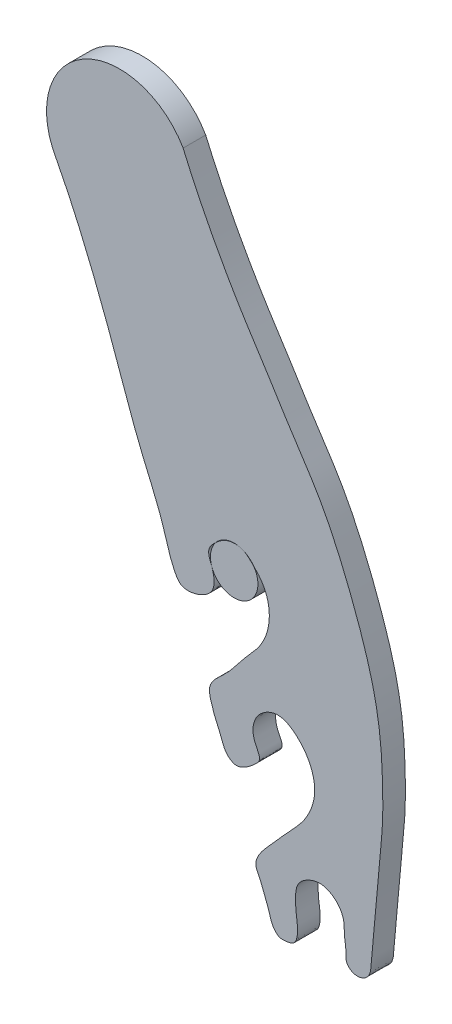
ISO-10303-21;
HEADER;
FILE_DESCRIPTION(('STEP AP214'),'2;1');
FILE_NAME('part.step','',(''),(''),'','','');
FILE_SCHEMA(('AUTOMOTIVE_DESIGN { 1 0 10303 214 1 1 1 1 }'));
ENDSEC;
DATA;
#1=APPLICATION_CONTEXT('core data for automotive mechanical design processes');
#2=APPLICATION_PROTOCOL_DEFINITION('international standard','automotive_design',2000,#1);
#3=PRODUCT_CONTEXT('',#1,'mechanical');
#4=PRODUCT('Part','Part','',(#3));
#5=PRODUCT_RELATED_PRODUCT_CATEGORY('part','',(#4));
#6=PRODUCT_DEFINITION_FORMATION('','',#4);
#7=PRODUCT_DEFINITION_CONTEXT('part definition',#1,'design');
#8=PRODUCT_DEFINITION('design','',#6,#7);
#9=PRODUCT_DEFINITION_SHAPE('','',#8);
#10=(LENGTH_UNIT() NAMED_UNIT(*) SI_UNIT(.MILLI.,.METRE.));
#11=(NAMED_UNIT(*) PLANE_ANGLE_UNIT() SI_UNIT($,.RADIAN.));
#12=(NAMED_UNIT(*) SI_UNIT($,.STERADIAN.) SOLID_ANGLE_UNIT());
#13=UNCERTAINTY_MEASURE_WITH_UNIT(LENGTH_MEASURE(1.E-05),#10,'distance_accuracy_value','');
#14=(GEOMETRIC_REPRESENTATION_CONTEXT(3) GLOBAL_UNCERTAINTY_ASSIGNED_CONTEXT((#13)) GLOBAL_UNIT_ASSIGNED_CONTEXT((#10,
#11,#12)) REPRESENTATION_CONTEXT('',''));
#15=CARTESIAN_POINT('',(0.,0.,0.));
#16=DIRECTION('',(0.,0.,1.));
#17=DIRECTION('',(1.,0.,0.));
#18=AXIS2_PLACEMENT_3D('',#15,#16,#17);
#19=CARTESIAN_POINT('',(-59.0867335114056,75.1585197037627,5.));
#20=CARTESIAN_POINT('',(-53.9346204091216,65.3788628462463,5.));
#21=CARTESIAN_POINT('',(-47.4390554512581,48.6837082710349,5.));
#22=CARTESIAN_POINT('',(-40.688736558049,28.9009979278177,5.));
#23=CARTESIAN_POINT('',(-35.5304183724358,18.0879657647005,5.));
#24=CARTESIAN_POINT('',(-33.8579577809246,10.7674343070757,5.));
#25=CARTESIAN_POINT('',(-31.3998362996276,6.57802106677436,5.));
#26=CARTESIAN_POINT('',(-27.5219492365526,7.01581801573386,5.));
#27=CARTESIAN_POINT('',(-23.9393229583878,9.27671727307309,5.));
#28=CARTESIAN_POINT('',(-24.0764116949098,13.535807514395,5.));
#29=CARTESIAN_POINT('',(-26.0223548032744,16.8232194647874,5.));
#30=CARTESIAN_POINT('',(-23.7500171417823,19.2982600625414,5.));
#31=CARTESIAN_POINT('',(-21.376028013917,21.2083047046469,5.));
#32=CARTESIAN_POINT('',(-17.7857469963341,21.2749184106261,5.));
#33=CARTESIAN_POINT('',(-15.8633790549527,19.3467985373797,5.));
#34=CARTESIAN_POINT('',(-14.1859396027409,17.7776622603364,5.));
#35=CARTESIAN_POINT('',(-12.3297106987941,15.0320557236874,5.));
#36=CARTESIAN_POINT('',(-11.4507685126685,10.0831162070745,5.));
#37=CARTESIAN_POINT('',(-13.3013060927024,4.55321523133934,5.));
#38=CARTESIAN_POINT('',(-17.8022226632041,0.0201694124523161,5.));
#39=CARTESIAN_POINT('',(-20.9236233601872,-4.70848851190603,5.));
#40=CARTESIAN_POINT('',(-25.6848919148439,-8.24729106828771,5.));
#41=CARTESIAN_POINT('',(-24.7171376000372,-12.3130908454352,5.));
#42=CARTESIAN_POINT('',(-23.7107567909008,-14.9774131674311,5.));
#43=CARTESIAN_POINT('',(-22.4756437758101,-17.5194111133045,5.));
#44=CARTESIAN_POINT('',(-21.7661820410865,-19.9616882709617,5.));
#45=CARTESIAN_POINT('',(-19.5677147424994,-21.6347614524844,5.));
#46=CARTESIAN_POINT('',(-17.0547050234001,-20.6234032452875,5.));
#47=CARTESIAN_POINT('',(-15.5148303275544,-19.3564667024287,5.));
#48=CARTESIAN_POINT('',(-13.6022413210824,-17.5441766860558,5.));
#49=CARTESIAN_POINT('',(-14.9603130437095,-15.2605382390708,5.));
#50=CARTESIAN_POINT('',(-15.7735877062972,-12.8169202748397,5.));
#51=CARTESIAN_POINT('',(-15.0948052191953,-9.85813829907841,5.));
#52=CARTESIAN_POINT('',(-12.9329369021278,-7.64371398063303,5.));
#53=CARTESIAN_POINT('',(-9.34166022804247,-6.43458878607931,5.));
#54=CARTESIAN_POINT('',(-5.4913749908454,-8.89757267070106,5.));
#55=CARTESIAN_POINT('',(-2.61301967575609,-12.6523587155516,5.));
#56=CARTESIAN_POINT('',(-1.56389084367576,-16.9770722154025,5.));
#57=CARTESIAN_POINT('',(-2.36809171631675,-20.9530875801138,5.));
#58=CARTESIAN_POINT('',(-4.25580525672841,-24.7009833933603,5.));
#59=CARTESIAN_POINT('',(-7.94237305607287,-28.466412654136,5.));
#60=CARTESIAN_POINT('',(-11.2363704668022,-32.2563884624217,5.));
#61=CARTESIAN_POINT('',(-13.9760508604816,-35.2296970965984,5.));
#62=CARTESIAN_POINT('',(-15.3063342429994,-38.0056889369046,5.));
#63=CARTESIAN_POINT('',(-13.922413952706,-40.2924528659359,5.));
#64=CARTESIAN_POINT('',(-13.1613990437115,-42.6176153595309,5.));
#65=CARTESIAN_POINT('',(-11.9897255447287,-45.2208306103088,5.));
#66=CARTESIAN_POINT('',(-11.508081610577,-47.7300220017059,5.));
#67=CARTESIAN_POINT('',(-9.86460186479938,-49.6721462729771,5.));
#68=CARTESIAN_POINT('',(-8.0547933575021,-49.4360233240608,5.));
#69=CARTESIAN_POINT('',(-6.19232498721251,-49.1607775023665,5.));
#70=CARTESIAN_POINT('',(-5.39620881542955,-46.3293059076238,5.));
#71=CARTESIAN_POINT('',(-5.95883219850282,-43.5509240436483,5.));
#72=CARTESIAN_POINT('',(-6.16851216774349,-40.2747659189104,5.));
#73=CARTESIAN_POINT('',(-5.99107213557137,-36.944497525088,5.));
#74=CARTESIAN_POINT('',(-3.31852216918873,-35.1012060667395,5.));
#75=CARTESIAN_POINT('',(-0.290133931830342,-34.2367562773027,5.));
#76=CARTESIAN_POINT('',(2.91584490100474,-35.7194969765132,5.));
#77=CARTESIAN_POINT('',(4.83146565858147,-38.7939492716301,5.));
#78=CARTESIAN_POINT('',(4.57059921095419,-42.077947310441,5.));
#79=CARTESIAN_POINT('',(5.22994309111668,-44.5841258956665,5.));
#80=CARTESIAN_POINT('',(4.92243771096731,-46.9269893259378,5.));
#81=CARTESIAN_POINT('',(6.59325327361756,-48.3133735595361,5.));
#82=CARTESIAN_POINT('',(8.63285925629375,-48.2844375815708,5.));
#83=CARTESIAN_POINT('',(10.3966410742948,-46.9214790088415,5.));
#84=CARTESIAN_POINT('',(10.6173195335293,-44.9495485284818,5.));
#85=CARTESIAN_POINT('',(10.8674362114861,-41.3465905762235,5.));
#86=CARTESIAN_POINT('',(11.3633249928665,-36.2232794673163,5.));
#87=CARTESIAN_POINT('',(12.0194329999847,-29.4871876869167,5.));
#88=CARTESIAN_POINT('',(12.5335656742452,-23.2802796795894,5.));
#89=CARTESIAN_POINT('',(13.2669361389922,-16.3210261485607,5.));
#90=CARTESIAN_POINT('',(13.2468383043408,-8.52578424672956,5.));
#91=CARTESIAN_POINT('',(12.7699809470057,0.115298957737392,5.));
#92=CARTESIAN_POINT('',(11.290030544535,8.71315325813478,5.));
#93=CARTESIAN_POINT('',(8.57964158769924,17.7147110875001,5.));
#94=CARTESIAN_POINT('',(4.65918935140636,28.1010516349342,5.));
#95=CARTESIAN_POINT('',(-0.377397825888756,39.1219031126708,5.));
#96=CARTESIAN_POINT('',(-6.82410773435023,48.3529544080711,5.));
#97=CARTESIAN_POINT('',(-11.9337184412852,56.8018556725787,5.));
#98=CARTESIAN_POINT('',(-20.7413347246258,70.1682609110035,5.));
#99=CARTESIAN_POINT('',(-26.9668790339203,81.8525052067424,5.));
#100=CARTESIAN_POINT('',(-30.9850079375646,91.196598097639,5.));
#101=B_SPLINE_CURVE_WITH_KNOTS('',3,(#19,#20,#21,#22,#23,#24,#25,#26,#27,#28,#29,#30,#31,#32,
#33,#34,#35,#36,#37,#38,#39,#40,#41,#42,#43,#44,#45,#46,#47,#48,#49,#50,#51,#52,#53,#54,#55,#56,
#57,#58,#59,#60,#61,#62,#63,#64,#65,#66,#67,#68,#69,#70,#71,#72,#73,#74,#75,#76,#77,#78,#79,#80,
#81,#82,#83,#84,#85,#86,#87,#88,#89,#90,#91,#92,#93,#94,#95,#96,#97,#98,#99,#100),.UNSPECIFIED.,
.F.,.F.,(4,1,1,1,1,1,1,1,1,1,1,1,1,1,1,1,1,1,1,1,1,1,1,1,1,1,1,1,1,1,1,1,1,1,1,1,1,1,1,1,1,1,1,
1,1,1,1,1,1,1,1,1,1,1,1,1,1,1,1,1,1,1,1,1,1,1,1,1,1,1,1,1,1,1,1,1,1,1,1,4),(0.,
0.0873394569445019,0.122518205965547,0.154526003355046,0.17363433754046,0.178356300677547,
0.1877523400195,0.197551247951358,0.206693528219401,0.216055212640687,0.221691693059472,
0.228804145433702,0.238707717567774,0.243941058255248,0.248249108767906,0.255571386644435,
0.26771931673974,0.283616469639116,0.296048224297848,0.313658019399417,0.326739548103663,
0.333250370237918,0.341962212801237,0.348063705877538,0.353713631020725,0.360676314080626,
0.364714938147767,0.37220145986358,0.376188830279465,0.38172475237111,0.388580265037037,
0.395502953628737,0.402401832386903,0.410616688302792,0.420878683707496,0.432954596079819,
0.445134806791692,0.451805617843627,0.462304251521838,0.475264191504644,0.490195111733352,
0.498691187242873,0.505626304596028,0.510038062198198,0.517164296365818,0.52379498348039,
0.5306412037791,0.53610900844786,0.539904406161453,0.543418663303669,0.548956490323289,
0.558110843502625,0.564731092106327,0.573167651760435,0.580565976871937,0.58663496770464,
0.595642441347538,0.604032026473668,0.611503439642707,0.61900125364726,0.623087474934673,
0.627664111858408,0.632724642143198,0.637027562650227,0.642687153488735,0.64635277806698,
0.663711927803744,0.680091231539028,0.695897733555089,0.709224188427907,0.731217372067665,
0.752778927598718,0.772428430989962,0.794821979949094,0.821372889404584,0.853601156451222,
0.883019250234345,0.903483119478519,0.925781115889162,1.),.UNSPECIFIED.);
#102=DIRECTION('',(0.,0.,-1.));
#103=VECTOR('',#102,1.);
#104=SURFACE_OF_LINEAR_EXTRUSION('',#101,#103);
#105=CARTESIAN_POINT('',(-59.0867335114056,75.1585197037627,0.));
#106=CARTESIAN_POINT('',(-53.9346204091216,65.3788628462463,0.));
#107=CARTESIAN_POINT('',(-47.4390554512581,48.6837082710349,0.));
#108=CARTESIAN_POINT('',(-40.688736558049,28.9009979278177,0.));
#109=CARTESIAN_POINT('',(-35.5304183724358,18.0879657647005,0.));
#110=CARTESIAN_POINT('',(-33.8579577809246,10.7674343070757,0.));
#111=CARTESIAN_POINT('',(-31.3998362996276,6.57802106677436,0.));
#112=CARTESIAN_POINT('',(-27.5219492365526,7.01581801573386,0.));
#113=CARTESIAN_POINT('',(-23.9393229583878,9.27671727307309,0.));
#114=CARTESIAN_POINT('',(-24.0764116949098,13.535807514395,0.));
#115=CARTESIAN_POINT('',(-26.0223548032744,16.8232194647874,0.));
#116=CARTESIAN_POINT('',(-23.7500171417823,19.2982600625414,0.));
#117=CARTESIAN_POINT('',(-21.376028013917,21.2083047046469,0.));
#118=CARTESIAN_POINT('',(-17.7857469963341,21.2749184106261,0.));
#119=CARTESIAN_POINT('',(-15.8633790549527,19.3467985373797,0.));
#120=CARTESIAN_POINT('',(-14.1859396027409,17.7776622603364,0.));
#121=CARTESIAN_POINT('',(-12.3297106987941,15.0320557236874,0.));
#122=CARTESIAN_POINT('',(-11.4507685126685,10.0831162070745,0.));
#123=CARTESIAN_POINT('',(-13.3013060927024,4.55321523133934,0.));
#124=CARTESIAN_POINT('',(-17.8022226632041,0.0201694124523161,0.));
#125=CARTESIAN_POINT('',(-20.9236233601872,-4.70848851190603,0.));
#126=CARTESIAN_POINT('',(-25.6848919148439,-8.24729106828771,0.));
#127=CARTESIAN_POINT('',(-24.7171376000372,-12.3130908454352,0.));
#128=CARTESIAN_POINT('',(-23.7107567909008,-14.9774131674311,0.));
#129=CARTESIAN_POINT('',(-22.4756437758101,-17.5194111133045,0.));
#130=CARTESIAN_POINT('',(-21.7661820410865,-19.9616882709617,0.));
#131=CARTESIAN_POINT('',(-19.5677147424994,-21.6347614524844,0.));
#132=CARTESIAN_POINT('',(-17.0547050234001,-20.6234032452875,0.));
#133=CARTESIAN_POINT('',(-15.5148303275544,-19.3564667024287,0.));
#134=CARTESIAN_POINT('',(-13.6022413210824,-17.5441766860558,0.));
#135=CARTESIAN_POINT('',(-14.9603130437095,-15.2605382390708,0.));
#136=CARTESIAN_POINT('',(-15.7735877062972,-12.8169202748397,0.));
#137=CARTESIAN_POINT('',(-15.0948052191953,-9.85813829907841,0.));
#138=CARTESIAN_POINT('',(-12.9329369021278,-7.64371398063303,0.));
#139=CARTESIAN_POINT('',(-9.34166022804247,-6.43458878607931,0.));
#140=CARTESIAN_POINT('',(-5.4913749908454,-8.89757267070106,0.));
#141=CARTESIAN_POINT('',(-2.61301967575609,-12.6523587155516,0.));
#142=CARTESIAN_POINT('',(-1.56389084367576,-16.9770722154025,0.));
#143=CARTESIAN_POINT('',(-2.36809171631675,-20.9530875801138,0.));
#144=CARTESIAN_POINT('',(-4.25580525672841,-24.7009833933603,0.));
#145=CARTESIAN_POINT('',(-7.94237305607287,-28.466412654136,0.));
#146=CARTESIAN_POINT('',(-11.2363704668022,-32.2563884624217,0.));
#147=CARTESIAN_POINT('',(-13.9760508604816,-35.2296970965984,0.));
#148=CARTESIAN_POINT('',(-15.3063342429994,-38.0056889369046,0.));
#149=CARTESIAN_POINT('',(-13.922413952706,-40.2924528659359,0.));
#150=CARTESIAN_POINT('',(-13.1613990437115,-42.6176153595309,0.));
#151=CARTESIAN_POINT('',(-11.9897255447287,-45.2208306103088,0.));
#152=CARTESIAN_POINT('',(-11.508081610577,-47.7300220017059,0.));
#153=CARTESIAN_POINT('',(-9.86460186479938,-49.6721462729771,0.));
#154=CARTESIAN_POINT('',(-8.0547933575021,-49.4360233240608,0.));
#155=CARTESIAN_POINT('',(-6.19232498721251,-49.1607775023665,0.));
#156=CARTESIAN_POINT('',(-5.39620881542955,-46.3293059076238,0.));
#157=CARTESIAN_POINT('',(-5.95883219850282,-43.5509240436483,0.));
#158=CARTESIAN_POINT('',(-6.16851216774349,-40.2747659189104,0.));
#159=CARTESIAN_POINT('',(-5.99107213557137,-36.944497525088,0.));
#160=CARTESIAN_POINT('',(-3.31852216918873,-35.1012060667395,0.));
#161=CARTESIAN_POINT('',(-0.290133931830342,-34.2367562773027,0.));
#162=CARTESIAN_POINT('',(2.91584490100474,-35.7194969765132,0.));
#163=CARTESIAN_POINT('',(4.83146565858147,-38.7939492716301,0.));
#164=CARTESIAN_POINT('',(4.57059921095419,-42.077947310441,0.));
#165=CARTESIAN_POINT('',(5.22994309111668,-44.5841258956665,0.));
#166=CARTESIAN_POINT('',(4.92243771096731,-46.9269893259378,0.));
#167=CARTESIAN_POINT('',(6.59325327361756,-48.3133735595361,0.));
#168=CARTESIAN_POINT('',(8.63285925629375,-48.2844375815708,0.));
#169=CARTESIAN_POINT('',(10.3966410742948,-46.9214790088415,0.));
#170=CARTESIAN_POINT('',(10.6173195335293,-44.9495485284818,0.));
#171=CARTESIAN_POINT('',(10.8674362114861,-41.3465905762235,0.));
#172=CARTESIAN_POINT('',(11.3633249928665,-36.2232794673163,0.));
#173=CARTESIAN_POINT('',(12.0194329999847,-29.4871876869167,0.));
#174=CARTESIAN_POINT('',(12.5335656742452,-23.2802796795894,0.));
#175=CARTESIAN_POINT('',(13.2669361389922,-16.3210261485607,0.));
#176=CARTESIAN_POINT('',(13.2468383043408,-8.52578424672956,0.));
#177=CARTESIAN_POINT('',(12.7699809470057,0.115298957737392,0.));
#178=CARTESIAN_POINT('',(11.290030544535,8.71315325813478,0.));
#179=CARTESIAN_POINT('',(8.57964158769924,17.7147110875001,0.));
#180=CARTESIAN_POINT('',(4.65918935140636,28.1010516349342,0.));
#181=CARTESIAN_POINT('',(-0.377397825888756,39.1219031126708,0.));
#182=CARTESIAN_POINT('',(-6.82410773435023,48.3529544080711,0.));
#183=CARTESIAN_POINT('',(-11.9337184412852,56.8018556725787,0.));
#184=CARTESIAN_POINT('',(-20.7413347246258,70.1682609110035,0.));
#185=CARTESIAN_POINT('',(-26.9668790339203,81.8525052067424,0.));
#186=CARTESIAN_POINT('',(-30.9850079375646,91.196598097639,0.));
#187=B_SPLINE_CURVE_WITH_KNOTS('',3,(#105,#106,#107,#108,#109,#110,#111,#112,#113,#114,#115,
#116,#117,#118,#119,#120,#121,#122,#123,#124,#125,#126,#127,#128,#129,#130,#131,#132,#133,#134,
#135,#136,#137,#138,#139,#140,#141,#142,#143,#144,#145,#146,#147,#148,#149,#150,#151,#152,#153,
#154,#155,#156,#157,#158,#159,#160,#161,#162,#163,#164,#165,#166,#167,#168,#169,#170,#171,#172,
#173,#174,#175,#176,#177,#178,#179,#180,#181,#182,#183,#184,#185,#186),.UNSPECIFIED.,.F.,.F.,(4,
1,1,1,1,1,1,1,1,1,1,1,1,1,1,1,1,1,1,1,1,1,1,1,1,1,1,1,1,1,1,1,1,1,1,1,1,1,1,1,1,1,1,1,1,1,1,1,1,
1,1,1,1,1,1,1,1,1,1,1,1,1,1,1,1,1,1,1,1,1,1,1,1,1,1,1,1,1,1,4),(0.,0.0873394569445019,
0.122518205965547,0.154526003355046,0.17363433754046,0.178356300677547,0.1877523400195,
0.197551247951358,0.206693528219401,0.216055212640687,0.221691693059472,0.228804145433702,
0.238707717567774,0.243941058255248,0.248249108767906,0.255571386644435,0.26771931673974,
0.283616469639116,0.296048224297848,0.313658019399417,0.326739548103663,0.333250370237918,
0.341962212801237,0.348063705877538,0.353713631020725,0.360676314080626,0.364714938147767,
0.37220145986358,0.376188830279465,0.38172475237111,0.388580265037037,0.395502953628737,
0.402401832386903,0.410616688302792,0.420878683707496,0.432954596079819,0.445134806791692,
0.451805617843627,0.462304251521838,0.475264191504644,0.490195111733352,0.498691187242873,
0.505626304596028,0.510038062198198,0.517164296365818,0.52379498348039,0.5306412037791,
0.53610900844786,0.539904406161453,0.543418663303669,0.548956490323289,0.558110843502625,
0.564731092106327,0.573167651760435,0.580565976871937,0.58663496770464,0.595642441347538,
0.604032026473668,0.611503439642707,0.61900125364726,0.623087474934673,0.627664111858408,
0.632724642143198,0.637027562650227,0.642687153488735,0.64635277806698,0.663711927803744,
0.680091231539028,0.695897733555089,0.709224188427907,0.731217372067665,0.752778927598718,
0.772428430989962,0.794821979949094,0.821372889404584,0.853601156451222,0.883019250234345,
0.903483119478519,0.925781115889162,1.),.UNSPECIFIED.);
#188=CARTESIAN_POINT('',(-23.7843612738959,19.1712902721729,0.));
#189=VERTEX_POINT('',#188);
#190=CARTESIAN_POINT('',(-18.3906140802592,20.9787363285706,0.));
#191=VERTEX_POINT('',#190);
#192=EDGE_CURVE('E113',#189,#191,#187,.T.);
#193=ORIENTED_EDGE('',*,*,#192,.F.);
#194=DIRECTION('',(0.,0.,-1.));
#195=VECTOR('',#194,1.);
#196=CARTESIAN_POINT('',(-23.7843612738959,19.1712902721729,5.));
#197=LINE('',#196,#195);
#198=CARTESIAN_POINT('',(-23.7843612738959,19.1712902721729,5.));
#199=VERTEX_POINT('',#198);
#200=EDGE_CURVE('E12',#199,#189,#197,.T.);
#201=ORIENTED_EDGE('',*,*,#200,.F.);
#202=CARTESIAN_POINT('',(-18.3906140802592,20.9787363285706,5.));
#203=VERTEX_POINT('',#202);
#204=EDGE_CURVE('E95',#199,#203,#101,.T.);
#205=ORIENTED_EDGE('',*,*,#204,.T.);
#206=DIRECTION('',(0.,0.,-1.));
#207=VECTOR('',#206,1.);
#208=CARTESIAN_POINT('',(-18.3906140802592,20.9787363285706,5.));
#209=LINE('',#208,#207);
#210=EDGE_CURVE('E85',#203,#191,#209,.T.);
#211=ORIENTED_EDGE('',*,*,#210,.T.);
#212=EDGE_LOOP('',(#193,#201,#205,#211));
#213=FACE_BOUND('',#212,.T.);
#214=ADVANCED_FACE('F45',(#213),#104,.T.);
#215=CARTESIAN_POINT('',(-19.6842185617889,15.8874034816918,5.));
#216=DIRECTION('',(0.,0.,-1.));
#217=DIRECTION('',(-1.,0.,0.));
#218=AXIS2_PLACEMENT_3D('',#215,#216,#217);
#219=CYLINDRICAL_SURFACE('',#218,5.253102198924);
#220=CARTESIAN_POINT('',(-19.6842185617889,15.8874034816918,0.));
#221=DIRECTION('',(0.,0.,1.));
#222=DIRECTION('',(1.,0.,0.));
#223=AXIS2_PLACEMENT_3D('',#220,#221,#222);
#224=CIRCLE('',#223,5.253102198924);
#225=CARTESIAN_POINT('',(-15.3761978705713,18.8934042196127,0.));
#226=VERTEX_POINT('',#225);
#227=EDGE_CURVE('E101',#189,#226,#224,.T.);
#228=ORIENTED_EDGE('',*,*,#227,.T.);
#229=DIRECTION('',(0.,0.,-1.));
#230=VECTOR('',#229,1.);
#231=CARTESIAN_POINT('',(-15.3761978705713,18.8934042196127,5.));
#232=LINE('',#231,#230);
#233=CARTESIAN_POINT('',(-15.3761978705713,18.8934042196127,5.));
#234=VERTEX_POINT('',#233);
#235=EDGE_CURVE('E55',#234,#226,#232,.T.);
#236=ORIENTED_EDGE('',*,*,#235,.F.);
#237=CARTESIAN_POINT('',(-19.6842185617889,15.8874034816918,5.));
#238=DIRECTION('',(0.,0.,1.));
#239=DIRECTION('',(1.,0.,0.));
#240=AXIS2_PLACEMENT_3D('',#237,#238,#239);
#241=CIRCLE('',#240,5.253102198924);
#242=EDGE_CURVE('E90',#199,#234,#241,.T.);
#243=ORIENTED_EDGE('',*,*,#242,.F.);
#244=ORIENTED_EDGE('',*,*,#200,.T.);
#245=EDGE_LOOP('',(#228,#236,#243,#244));
#246=FACE_BOUND('',#245,.T.);
#247=ADVANCED_FACE('F99',(#246),#219,.T.);
#248=CARTESIAN_POINT('',(-17.6392690451932,20.7261289530236,0.));
#249=VERTEX_POINT('',#248);
#250=EDGE_CURVE('E109',#249,#226,#187,.T.);
#251=ORIENTED_EDGE('',*,*,#250,.F.);
#252=DIRECTION('',(0.,0.,-1.));
#253=VECTOR('',#252,1.);
#254=CARTESIAN_POINT('',(-17.6392690451932,20.7261289530236,5.));
#255=LINE('',#254,#253);
#256=CARTESIAN_POINT('',(-17.6392690451932,20.7261289530236,5.));
#257=VERTEX_POINT('',#256);
#258=EDGE_CURVE('E78',#257,#249,#255,.T.);
#259=ORIENTED_EDGE('',*,*,#258,.F.);
#260=EDGE_CURVE('E94',#257,#234,#101,.T.);
#261=ORIENTED_EDGE('',*,*,#260,.T.);
#262=ORIENTED_EDGE('',*,*,#235,.T.);
#263=EDGE_LOOP('',(#251,#259,#261,#262));
#264=FACE_BOUND('',#263,.T.);
#265=ADVANCED_FACE('F47',(#264),#104,.T.);
#266=EDGE_CURVE('E108',#249,#191,#224,.T.);
#267=ORIENTED_EDGE('',*,*,#266,.T.);
#268=ORIENTED_EDGE('',*,*,#210,.F.);
#269=EDGE_CURVE('E63',#257,#203,#241,.T.);
#270=ORIENTED_EDGE('',*,*,#269,.F.);
#271=ORIENTED_EDGE('',*,*,#258,.T.);
#272=EDGE_LOOP('',(#267,#268,#270,#271));
#273=FACE_BOUND('',#272,.T.);
#274=ADVANCED_FACE('F126',(#273),#219,.T.);
#275=CARTESIAN_POINT('',(0.,0.,5.));
#276=DIRECTION('',(0.,0.,1.));
#277=DIRECTION('',(1.,0.,0.));
#278=AXIS2_PLACEMENT_3D('',#275,#276,#277);
#279=PLANE('',#278);
#280=ORIENTED_EDGE('',*,*,#204,.F.);
#281=ORIENTED_EDGE('',*,*,#242,.T.);
#282=ORIENTED_EDGE('',*,*,#260,.F.);
#283=ORIENTED_EDGE('',*,*,#269,.T.);
#284=EDGE_LOOP('',(#280,#281,#282,#283));
#285=FACE_BOUND('',#284,.T.);
#286=ADVANCED_FACE('F92',(#285),#279,.T.);
#287=CARTESIAN_POINT('',(0.,0.,0.));
#288=DIRECTION('',(0.,0.,1.));
#289=DIRECTION('',(1.,0.,0.));
#290=AXIS2_PLACEMENT_3D('',#287,#288,#289);
#291=PLANE('',#290);
#292=ORIENTED_EDGE('',*,*,#192,.T.);
#293=ORIENTED_EDGE('',*,*,#266,.F.);
#294=ORIENTED_EDGE('',*,*,#250,.T.);
#295=ORIENTED_EDGE('',*,*,#227,.F.);
#296=EDGE_LOOP('',(#292,#293,#294,#295));
#297=FACE_BOUND('',#296,.T.);
#298=ADVANCED_FACE('F121',(#297),#291,.F.);
#299=CLOSED_SHELL('',(#214,#247,#265,#274,#286,#298));
#300=MANIFOLD_SOLID_BREP('B2',#299);
#301=CARTESIAN_POINT('',(-45.0358707244851,83.1775589007009,5.));
#302=DIRECTION('',(0.,0.,-1.));
#303=DIRECTION('',(-1.,0.,0.));
#304=AXIS2_PLACEMENT_3D('',#301,#302,#303);
#305=CYLINDRICAL_SURFACE('',#304,16.1781251910998);
#306=CARTESIAN_POINT('',(-45.0358707244851,83.1775589007009,0.));
#307=DIRECTION('',(0.,0.,1.));
#308=DIRECTION('',(1.,0.,0.));
#309=AXIS2_PLACEMENT_3D('',#306,#307,#308);
#310=CIRCLE('',#309,16.1781251910998);
#311=CARTESIAN_POINT('',(-30.9850079375646,91.196598097639,0.));
#312=VERTEX_POINT('',#311);
#313=CARTESIAN_POINT('',(-59.0867335114056,75.1585197037627,0.));
#314=VERTEX_POINT('',#313);
#315=EDGE_CURVE('E284',#312,#314,#310,.T.);
#316=ORIENTED_EDGE('',*,*,#315,.T.);
#317=DIRECTION('',(0.,0.,-1.));
#318=VECTOR('',#317,1.);
#319=CARTESIAN_POINT('',(-59.0867335114056,75.1585197037627,5.));
#320=LINE('',#319,#318);
#321=CARTESIAN_POINT('',(-59.0867335114056,75.1585197037627,5.));
#322=VERTEX_POINT('',#321);
#323=EDGE_CURVE('E43',#322,#314,#320,.T.);
#324=ORIENTED_EDGE('',*,*,#323,.F.);
#325=CARTESIAN_POINT('',(-45.0358707244851,83.1775589007009,5.));
#326=DIRECTION('',(0.,0.,1.));
#327=DIRECTION('',(1.,0.,0.));
#328=AXIS2_PLACEMENT_3D('',#325,#326,#327);
#329=CIRCLE('',#328,16.1781251910998);
#330=CARTESIAN_POINT('',(-30.9850079375646,91.196598097639,5.));
#331=VERTEX_POINT('',#330);
#332=EDGE_CURVE('E255',#331,#322,#329,.T.);
#333=ORIENTED_EDGE('',*,*,#332,.F.);
#334=DIRECTION('',(0.,0.,-1.));
#335=VECTOR('',#334,1.);
#336=CARTESIAN_POINT('',(-30.9850079375646,91.196598097639,5.));
#337=LINE('',#336,#335);
#338=EDGE_CURVE('E252',#331,#312,#337,.T.);
#339=ORIENTED_EDGE('',*,*,#338,.T.);
#340=EDGE_LOOP('',(#316,#324,#333,#339));
#341=FACE_BOUND('',#340,.T.);
#342=ADVANCED_FACE('F174',(#341),#305,.T.);
#343=CARTESIAN_POINT('',(-59.0867335114056,75.1585197037627,5.));
#344=CARTESIAN_POINT('',(-53.9346204091216,65.3788628462463,5.));
#345=CARTESIAN_POINT('',(-47.4390554512581,48.6837082710349,5.));
#346=CARTESIAN_POINT('',(-40.688736558049,28.9009979278177,5.));
#347=CARTESIAN_POINT('',(-35.5304183724358,18.0879657647005,5.));
#348=CARTESIAN_POINT('',(-33.8579577809246,10.7674343070757,5.));
#349=CARTESIAN_POINT('',(-31.3998362996276,6.57802106677436,5.));
#350=CARTESIAN_POINT('',(-27.5219492365526,7.01581801573386,5.));
#351=CARTESIAN_POINT('',(-23.9393229583878,9.27671727307309,5.));
#352=CARTESIAN_POINT('',(-24.0764116949098,13.535807514395,5.));
#353=CARTESIAN_POINT('',(-26.0223548032744,16.8232194647874,5.));
#354=CARTESIAN_POINT('',(-23.7500171417823,19.2982600625414,5.));
#355=CARTESIAN_POINT('',(-21.376028013917,21.2083047046469,5.));
#356=CARTESIAN_POINT('',(-17.7857469963341,21.2749184106261,5.));
#357=CARTESIAN_POINT('',(-15.8633790549527,19.3467985373797,5.));
#358=CARTESIAN_POINT('',(-14.1859396027409,17.7776622603364,5.));
#359=CARTESIAN_POINT('',(-12.3297106987941,15.0320557236874,5.));
#360=CARTESIAN_POINT('',(-11.4507685126685,10.0831162070745,5.));
#361=CARTESIAN_POINT('',(-13.3013060927024,4.55321523133934,5.));
#362=CARTESIAN_POINT('',(-17.8022226632041,0.0201694124523161,5.));
#363=CARTESIAN_POINT('',(-20.9236233601872,-4.70848851190603,5.));
#364=CARTESIAN_POINT('',(-25.6848919148439,-8.24729106828771,5.));
#365=CARTESIAN_POINT('',(-24.7171376000372,-12.3130908454352,5.));
#366=CARTESIAN_POINT('',(-23.7107567909008,-14.9774131674311,5.));
#367=CARTESIAN_POINT('',(-22.4756437758101,-17.5194111133045,5.));
#368=CARTESIAN_POINT('',(-21.7661820410865,-19.9616882709617,5.));
#369=CARTESIAN_POINT('',(-19.5677147424994,-21.6347614524844,5.));
#370=CARTESIAN_POINT('',(-17.0547050234001,-20.6234032452875,5.));
#371=CARTESIAN_POINT('',(-15.5148303275544,-19.3564667024287,5.));
#372=CARTESIAN_POINT('',(-13.6022413210824,-17.5441766860558,5.));
#373=CARTESIAN_POINT('',(-14.9603130437095,-15.2605382390708,5.));
#374=CARTESIAN_POINT('',(-15.7735877062972,-12.8169202748397,5.));
#375=CARTESIAN_POINT('',(-15.0948052191953,-9.85813829907841,5.));
#376=CARTESIAN_POINT('',(-12.9329369021278,-7.64371398063303,5.));
#377=CARTESIAN_POINT('',(-9.34166022804247,-6.43458878607931,5.));
#378=CARTESIAN_POINT('',(-5.4913749908454,-8.89757267070106,5.));
#379=CARTESIAN_POINT('',(-2.61301967575609,-12.6523587155516,5.));
#380=CARTESIAN_POINT('',(-1.56389084367576,-16.9770722154025,5.));
#381=CARTESIAN_POINT('',(-2.36809171631675,-20.9530875801138,5.));
#382=CARTESIAN_POINT('',(-4.25580525672841,-24.7009833933603,5.));
#383=CARTESIAN_POINT('',(-7.94237305607287,-28.466412654136,5.));
#384=CARTESIAN_POINT('',(-11.2363704668022,-32.2563884624217,5.));
#385=CARTESIAN_POINT('',(-13.9760508604816,-35.2296970965984,5.));
#386=CARTESIAN_POINT('',(-15.3063342429994,-38.0056889369046,5.));
#387=CARTESIAN_POINT('',(-13.922413952706,-40.2924528659359,5.));
#388=CARTESIAN_POINT('',(-13.1613990437115,-42.6176153595309,5.));
#389=CARTESIAN_POINT('',(-11.9897255447287,-45.2208306103088,5.));
#390=CARTESIAN_POINT('',(-11.508081610577,-47.7300220017059,5.));
#391=CARTESIAN_POINT('',(-9.86460186479938,-49.6721462729771,5.));
#392=CARTESIAN_POINT('',(-8.0547933575021,-49.4360233240608,5.));
#393=CARTESIAN_POINT('',(-6.19232498721251,-49.1607775023665,5.));
#394=CARTESIAN_POINT('',(-5.39620881542955,-46.3293059076238,5.));
#395=CARTESIAN_POINT('',(-5.95883219850282,-43.5509240436483,5.));
#396=CARTESIAN_POINT('',(-6.16851216774349,-40.2747659189104,5.));
#397=CARTESIAN_POINT('',(-5.99107213557137,-36.944497525088,5.));
#398=CARTESIAN_POINT('',(-3.31852216918873,-35.1012060667395,5.));
#399=CARTESIAN_POINT('',(-0.290133931830342,-34.2367562773027,5.));
#400=CARTESIAN_POINT('',(2.91584490100474,-35.7194969765132,5.));
#401=CARTESIAN_POINT('',(4.83146565858147,-38.7939492716301,5.));
#402=CARTESIAN_POINT('',(4.57059921095419,-42.077947310441,5.));
#403=CARTESIAN_POINT('',(5.22994309111668,-44.5841258956665,5.));
#404=CARTESIAN_POINT('',(4.92243771096731,-46.9269893259378,5.));
#405=CARTESIAN_POINT('',(6.59325327361756,-48.3133735595361,5.));
#406=CARTESIAN_POINT('',(8.63285925629375,-48.2844375815708,5.));
#407=CARTESIAN_POINT('',(10.3966410742948,-46.9214790088415,5.));
#408=CARTESIAN_POINT('',(10.6173195335293,-44.9495485284818,5.));
#409=CARTESIAN_POINT('',(10.8674362114861,-41.3465905762235,5.));
#410=CARTESIAN_POINT('',(11.3633249928665,-36.2232794673163,5.));
#411=CARTESIAN_POINT('',(12.0194329999847,-29.4871876869167,5.));
#412=CARTESIAN_POINT('',(12.5335656742452,-23.2802796795894,5.));
#413=CARTESIAN_POINT('',(13.2669361389922,-16.3210261485607,5.));
#414=CARTESIAN_POINT('',(13.2468383043408,-8.52578424672956,5.));
#415=CARTESIAN_POINT('',(12.7699809470057,0.115298957737392,5.));
#416=CARTESIAN_POINT('',(11.290030544535,8.71315325813478,5.));
#417=CARTESIAN_POINT('',(8.57964158769924,17.7147110875001,5.));
#418=CARTESIAN_POINT('',(4.65918935140636,28.1010516349342,5.));
#419=CARTESIAN_POINT('',(-0.377397825888756,39.1219031126708,5.));
#420=CARTESIAN_POINT('',(-6.82410773435023,48.3529544080711,5.));
#421=CARTESIAN_POINT('',(-11.9337184412852,56.8018556725787,5.));
#422=CARTESIAN_POINT('',(-20.7413347246258,70.1682609110035,5.));
#423=CARTESIAN_POINT('',(-26.9668790339203,81.8525052067424,5.));
#424=CARTESIAN_POINT('',(-30.9850079375646,91.196598097639,5.));
#425=B_SPLINE_CURVE_WITH_KNOTS('',3,(#343,#344,#345,#346,#347,#348,#349,#350,#351,#352,#353,
#354,#355,#356,#357,#358,#359,#360,#361,#362,#363,#364,#365,#366,#367,#368,#369,#370,#371,#372,
#373,#374,#375,#376,#377,#378,#379,#380,#381,#382,#383,#384,#385,#386,#387,#388,#389,#390,#391,
#392,#393,#394,#395,#396,#397,#398,#399,#400,#401,#402,#403,#404,#405,#406,#407,#408,#409,#410,
#411,#412,#413,#414,#415,#416,#417,#418,#419,#420,#421,#422,#423,#424),.UNSPECIFIED.,.F.,.F.,(4,
1,1,1,1,1,1,1,1,1,1,1,1,1,1,1,1,1,1,1,1,1,1,1,1,1,1,1,1,1,1,1,1,1,1,1,1,1,1,1,1,1,1,1,1,1,1,1,1,
1,1,1,1,1,1,1,1,1,1,1,1,1,1,1,1,1,1,1,1,1,1,1,1,1,1,1,1,1,1,4),(0.,0.0873394569445019,
0.122518205965547,0.154526003355046,0.17363433754046,0.178356300677547,0.1877523400195,
0.197551247951358,0.206693528219401,0.216055212640687,0.221691693059472,0.228804145433702,
0.238707717567774,0.243941058255248,0.248249108767906,0.255571386644435,0.26771931673974,
0.283616469639116,0.296048224297848,0.313658019399417,0.326739548103663,0.333250370237918,
0.341962212801237,0.348063705877538,0.353713631020725,0.360676314080626,0.364714938147767,
0.37220145986358,0.376188830279465,0.38172475237111,0.388580265037037,0.395502953628737,
0.402401832386903,0.410616688302792,0.420878683707496,0.432954596079819,0.445134806791692,
0.451805617843627,0.462304251521838,0.475264191504644,0.490195111733352,0.498691187242873,
0.505626304596028,0.510038062198198,0.517164296365818,0.52379498348039,0.5306412037791,
0.53610900844786,0.539904406161453,0.543418663303669,0.548956490323289,0.558110843502625,
0.564731092106327,0.573167651760435,0.580565976871937,0.58663496770464,0.595642441347538,
0.604032026473668,0.611503439642707,0.61900125364726,0.623087474934673,0.627664111858408,
0.632724642143198,0.637027562650227,0.642687153488735,0.64635277806698,0.663711927803744,
0.680091231539028,0.695897733555089,0.709224188427907,0.731217372067665,0.752778927598718,
0.772428430989962,0.794821979949094,0.821372889404584,0.853601156451222,0.883019250234345,
0.903483119478519,0.925781115889162,1.),.UNSPECIFIED.);
#426=DIRECTION('',(0.,0.,-1.));
#427=VECTOR('',#426,1.);
#428=SURFACE_OF_LINEAR_EXTRUSION('',#425,#427);
#429=CARTESIAN_POINT('',(-59.0867335114056,75.1585197037627,0.));
#430=CARTESIAN_POINT('',(-53.9346204091216,65.3788628462463,0.));
#431=CARTESIAN_POINT('',(-47.4390554512581,48.6837082710349,0.));
#432=CARTESIAN_POINT('',(-40.688736558049,28.9009979278177,0.));
#433=CARTESIAN_POINT('',(-35.5304183724358,18.0879657647005,0.));
#434=CARTESIAN_POINT('',(-33.8579577809246,10.7674343070757,0.));
#435=CARTESIAN_POINT('',(-31.3998362996276,6.57802106677436,0.));
#436=CARTESIAN_POINT('',(-27.5219492365526,7.01581801573386,0.));
#437=CARTESIAN_POINT('',(-23.9393229583878,9.27671727307309,0.));
#438=CARTESIAN_POINT('',(-24.0764116949098,13.535807514395,0.));
#439=CARTESIAN_POINT('',(-26.0223548032744,16.8232194647874,0.));
#440=CARTESIAN_POINT('',(-23.7500171417823,19.2982600625414,0.));
#441=CARTESIAN_POINT('',(-21.376028013917,21.2083047046469,0.));
#442=CARTESIAN_POINT('',(-17.7857469963341,21.2749184106261,0.));
#443=CARTESIAN_POINT('',(-15.8633790549527,19.3467985373797,0.));
#444=CARTESIAN_POINT('',(-14.1859396027409,17.7776622603364,0.));
#445=CARTESIAN_POINT('',(-12.3297106987941,15.0320557236874,0.));
#446=CARTESIAN_POINT('',(-11.4507685126685,10.0831162070745,0.));
#447=CARTESIAN_POINT('',(-13.3013060927024,4.55321523133934,0.));
#448=CARTESIAN_POINT('',(-17.8022226632041,0.0201694124523161,0.));
#449=CARTESIAN_POINT('',(-20.9236233601872,-4.70848851190603,0.));
#450=CARTESIAN_POINT('',(-25.6848919148439,-8.24729106828771,0.));
#451=CARTESIAN_POINT('',(-24.7171376000372,-12.3130908454352,0.));
#452=CARTESIAN_POINT('',(-23.7107567909008,-14.9774131674311,0.));
#453=CARTESIAN_POINT('',(-22.4756437758101,-17.5194111133045,0.));
#454=CARTESIAN_POINT('',(-21.7661820410865,-19.9616882709617,0.));
#455=CARTESIAN_POINT('',(-19.5677147424994,-21.6347614524844,0.));
#456=CARTESIAN_POINT('',(-17.0547050234001,-20.6234032452875,0.));
#457=CARTESIAN_POINT('',(-15.5148303275544,-19.3564667024287,0.));
#458=CARTESIAN_POINT('',(-13.6022413210824,-17.5441766860558,0.));
#459=CARTESIAN_POINT('',(-14.9603130437095,-15.2605382390708,0.));
#460=CARTESIAN_POINT('',(-15.7735877062972,-12.8169202748397,0.));
#461=CARTESIAN_POINT('',(-15.0948052191953,-9.85813829907841,0.));
#462=CARTESIAN_POINT('',(-12.9329369021278,-7.64371398063303,0.));
#463=CARTESIAN_POINT('',(-9.34166022804247,-6.43458878607931,0.));
#464=CARTESIAN_POINT('',(-5.4913749908454,-8.89757267070106,0.));
#465=CARTESIAN_POINT('',(-2.61301967575609,-12.6523587155516,0.));
#466=CARTESIAN_POINT('',(-1.56389084367576,-16.9770722154025,0.));
#467=CARTESIAN_POINT('',(-2.36809171631675,-20.9530875801138,0.));
#468=CARTESIAN_POINT('',(-4.25580525672841,-24.7009833933603,0.));
#469=CARTESIAN_POINT('',(-7.94237305607287,-28.466412654136,0.));
#470=CARTESIAN_POINT('',(-11.2363704668022,-32.2563884624217,0.));
#471=CARTESIAN_POINT('',(-13.9760508604816,-35.2296970965984,0.));
#472=CARTESIAN_POINT('',(-15.3063342429994,-38.0056889369046,0.));
#473=CARTESIAN_POINT('',(-13.922413952706,-40.2924528659359,0.));
#474=CARTESIAN_POINT('',(-13.1613990437115,-42.6176153595309,0.));
#475=CARTESIAN_POINT('',(-11.9897255447287,-45.2208306103088,0.));
#476=CARTESIAN_POINT('',(-11.508081610577,-47.7300220017059,0.));
#477=CARTESIAN_POINT('',(-9.86460186479938,-49.6721462729771,0.));
#478=CARTESIAN_POINT('',(-8.0547933575021,-49.4360233240608,0.));
#479=CARTESIAN_POINT('',(-6.19232498721251,-49.1607775023665,0.));
#480=CARTESIAN_POINT('',(-5.39620881542955,-46.3293059076238,0.));
#481=CARTESIAN_POINT('',(-5.95883219850282,-43.5509240436483,0.));
#482=CARTESIAN_POINT('',(-6.16851216774349,-40.2747659189104,0.));
#483=CARTESIAN_POINT('',(-5.99107213557137,-36.944497525088,0.));
#484=CARTESIAN_POINT('',(-3.31852216918873,-35.1012060667395,0.));
#485=CARTESIAN_POINT('',(-0.290133931830342,-34.2367562773027,0.));
#486=CARTESIAN_POINT('',(2.91584490100474,-35.7194969765132,0.));
#487=CARTESIAN_POINT('',(4.83146565858147,-38.7939492716301,0.));
#488=CARTESIAN_POINT('',(4.57059921095419,-42.077947310441,0.));
#489=CARTESIAN_POINT('',(5.22994309111668,-44.5841258956665,0.));
#490=CARTESIAN_POINT('',(4.92243771096731,-46.9269893259378,0.));
#491=CARTESIAN_POINT('',(6.59325327361756,-48.3133735595361,0.));
#492=CARTESIAN_POINT('',(8.63285925629375,-48.2844375815708,0.));
#493=CARTESIAN_POINT('',(10.3966410742948,-46.9214790088415,0.));
#494=CARTESIAN_POINT('',(10.6173195335293,-44.9495485284818,0.));
#495=CARTESIAN_POINT('',(10.8674362114861,-41.3465905762235,0.));
#496=CARTESIAN_POINT('',(11.3633249928665,-36.2232794673163,0.));
#497=CARTESIAN_POINT('',(12.0194329999847,-29.4871876869167,0.));
#498=CARTESIAN_POINT('',(12.5335656742452,-23.2802796795894,0.));
#499=CARTESIAN_POINT('',(13.2669361389922,-16.3210261485607,0.));
#500=CARTESIAN_POINT('',(13.2468383043408,-8.52578424672956,0.));
#501=CARTESIAN_POINT('',(12.7699809470057,0.115298957737392,0.));
#502=CARTESIAN_POINT('',(11.290030544535,8.71315325813478,0.));
#503=CARTESIAN_POINT('',(8.57964158769924,17.7147110875001,0.));
#504=CARTESIAN_POINT('',(4.65918935140636,28.1010516349342,0.));
#505=CARTESIAN_POINT('',(-0.377397825888756,39.1219031126708,0.));
#506=CARTESIAN_POINT('',(-6.82410773435023,48.3529544080711,0.));
#507=CARTESIAN_POINT('',(-11.9337184412852,56.8018556725787,0.));
#508=CARTESIAN_POINT('',(-20.7413347246258,70.1682609110035,0.));
#509=CARTESIAN_POINT('',(-26.9668790339203,81.8525052067424,0.));
#510=CARTESIAN_POINT('',(-30.9850079375646,91.196598097639,0.));
#511=B_SPLINE_CURVE_WITH_KNOTS('',3,(#429,#430,#431,#432,#433,#434,#435,#436,#437,#438,#439,
#440,#441,#442,#443,#444,#445,#446,#447,#448,#449,#450,#451,#452,#453,#454,#455,#456,#457,#458,
#459,#460,#461,#462,#463,#464,#465,#466,#467,#468,#469,#470,#471,#472,#473,#474,#475,#476,#477,
#478,#479,#480,#481,#482,#483,#484,#485,#486,#487,#488,#489,#490,#491,#492,#493,#494,#495,#496,
#497,#498,#499,#500,#501,#502,#503,#504,#505,#506,#507,#508,#509,#510),.UNSPECIFIED.,.F.,.F.,(4,
1,1,1,1,1,1,1,1,1,1,1,1,1,1,1,1,1,1,1,1,1,1,1,1,1,1,1,1,1,1,1,1,1,1,1,1,1,1,1,1,1,1,1,1,1,1,1,1,
1,1,1,1,1,1,1,1,1,1,1,1,1,1,1,1,1,1,1,1,1,1,1,1,1,1,1,1,1,1,4),(0.,0.0873394569445019,
0.122518205965547,0.154526003355046,0.17363433754046,0.178356300677547,0.1877523400195,
0.197551247951358,0.206693528219401,0.216055212640687,0.221691693059472,0.228804145433702,
0.238707717567774,0.243941058255248,0.248249108767906,0.255571386644435,0.26771931673974,
0.283616469639116,0.296048224297848,0.313658019399417,0.326739548103663,0.333250370237918,
0.341962212801237,0.348063705877538,0.353713631020725,0.360676314080626,0.364714938147767,
0.37220145986358,0.376188830279465,0.38172475237111,0.388580265037037,0.395502953628737,
0.402401832386903,0.410616688302792,0.420878683707496,0.432954596079819,0.445134806791692,
0.451805617843627,0.462304251521838,0.475264191504644,0.490195111733352,0.498691187242873,
0.505626304596028,0.510038062198198,0.517164296365818,0.52379498348039,0.5306412037791,
0.53610900844786,0.539904406161453,0.543418663303669,0.548956490323289,0.558110843502625,
0.564731092106327,0.573167651760435,0.580565976871937,0.58663496770464,0.595642441347538,
0.604032026473668,0.611503439642707,0.61900125364726,0.623087474934673,0.627664111858408,
0.632724642143198,0.637027562650227,0.642687153488735,0.64635277806698,0.663711927803744,
0.680091231539028,0.695897733555089,0.709224188427907,0.731217372067665,0.752778927598718,
0.772428430989962,0.794821979949094,0.821372889404584,0.853601156451222,0.883019250234345,
0.903483119478519,0.925781115889162,1.),.UNSPECIFIED.);
#512=CARTESIAN_POINT('',(-23.7843612738959,19.1712902721729,0.));
#513=VERTEX_POINT('',#512);
#514=EDGE_CURVE('E287',#314,#513,#511,.T.);
#515=ORIENTED_EDGE('',*,*,#514,.T.);
#516=DIRECTION('',(0.,0.,-1.));
#517=VECTOR('',#516,1.);
#518=CARTESIAN_POINT('',(-23.7843612738959,19.1712902721729,5.));
#519=LINE('',#518,#517);
#520=CARTESIAN_POINT('',(-23.7843612738959,19.1712902721729,5.));
#521=VERTEX_POINT('',#520);
#522=EDGE_CURVE('E182',#521,#513,#519,.T.);
#523=ORIENTED_EDGE('',*,*,#522,.F.);
#524=EDGE_CURVE('E223',#322,#521,#425,.T.);
#525=ORIENTED_EDGE('',*,*,#524,.F.);
#526=ORIENTED_EDGE('',*,*,#323,.T.);
#527=EDGE_LOOP('',(#515,#523,#525,#526));
#528=FACE_BOUND('',#527,.T.);
#529=ADVANCED_FACE('F267',(#528),#428,.F.);
#530=CARTESIAN_POINT('',(-19.6842185617889,15.8874034816918,5.));
#531=DIRECTION('',(0.,0.,-1.));
#532=DIRECTION('',(-1.,0.,0.));
#533=AXIS2_PLACEMENT_3D('',#530,#531,#532);
#534=CYLINDRICAL_SURFACE('',#533,5.253102198924);
#535=CARTESIAN_POINT('',(-19.6842185617889,15.8874034816918,0.));
#536=DIRECTION('',(0.,0.,1.));
#537=DIRECTION('',(1.,0.,0.));
#538=AXIS2_PLACEMENT_3D('',#535,#536,#537);
#539=CIRCLE('',#538,5.253102198924);
#540=CARTESIAN_POINT('',(-18.3906140802592,20.9787363285706,0.));
#541=VERTEX_POINT('',#540);
#542=EDGE_CURVE('E289',#541,#513,#539,.T.);
#543=ORIENTED_EDGE('',*,*,#542,.F.);
#544=DIRECTION('',(0.,0.,-1.));
#545=VECTOR('',#544,1.);
#546=CARTESIAN_POINT('',(-18.3906140802592,20.9787363285706,5.));
#547=LINE('',#546,#545);
#548=CARTESIAN_POINT('',(-18.3906140802592,20.9787363285706,5.));
#549=VERTEX_POINT('',#548);
#550=EDGE_CURVE('E248',#549,#541,#547,.T.);
#551=ORIENTED_EDGE('',*,*,#550,.F.);
#552=CARTESIAN_POINT('',(-19.6842185617889,15.8874034816918,5.));
#553=DIRECTION('',(0.,0.,1.));
#554=DIRECTION('',(1.,0.,0.));
#555=AXIS2_PLACEMENT_3D('',#552,#553,#554);
#556=CIRCLE('',#555,5.253102198924);
#557=EDGE_CURVE('E237',#549,#521,#556,.T.);
#558=ORIENTED_EDGE('',*,*,#557,.T.);
#559=ORIENTED_EDGE('',*,*,#522,.T.);
#560=EDGE_LOOP('',(#543,#551,#558,#559));
#561=FACE_BOUND('',#560,.T.);
#562=ADVANCED_FACE('F271',(#561),#534,.F.);
#563=CARTESIAN_POINT('',(-17.6392690451932,20.7261289530236,0.));
#564=VERTEX_POINT('',#563);
#565=EDGE_CURVE('E244',#541,#564,#511,.T.);
#566=ORIENTED_EDGE('',*,*,#565,.T.);
#567=DIRECTION('',(0.,0.,-1.));
#568=VECTOR('',#567,1.);
#569=CARTESIAN_POINT('',(-17.6392690451932,20.7261289530236,5.));
#570=LINE('',#569,#568);
#571=CARTESIAN_POINT('',(-17.6392690451932,20.7261289530236,5.));
#572=VERTEX_POINT('',#571);
#573=EDGE_CURVE('E241',#572,#564,#570,.T.);
#574=ORIENTED_EDGE('',*,*,#573,.F.);
#575=EDGE_CURVE('E231',#549,#572,#425,.T.);
#576=ORIENTED_EDGE('',*,*,#575,.F.);
#577=ORIENTED_EDGE('',*,*,#550,.T.);
#578=EDGE_LOOP('',(#566,#574,#576,#577));
#579=FACE_BOUND('',#578,.T.);
#580=ADVANCED_FACE('F242',(#579),#428,.F.);
#581=CARTESIAN_POINT('',(-15.3761978705713,18.8934042196127,0.));
#582=VERTEX_POINT('',#581);
#583=EDGE_CURVE('E299',#582,#564,#539,.T.);
#584=ORIENTED_EDGE('',*,*,#583,.F.);
#585=DIRECTION('',(0.,0.,-1.));
#586=VECTOR('',#585,1.);
#587=CARTESIAN_POINT('',(-15.3761978705713,18.8934042196127,5.));
#588=LINE('',#587,#586);
#589=CARTESIAN_POINT('',(-15.3761978705713,18.8934042196127,5.));
#590=VERTEX_POINT('',#589);
#591=EDGE_CURVE('E212',#590,#582,#588,.T.);
#592=ORIENTED_EDGE('',*,*,#591,.F.);
#593=EDGE_CURVE('E235',#590,#572,#556,.T.);
#594=ORIENTED_EDGE('',*,*,#593,.T.);
#595=ORIENTED_EDGE('',*,*,#573,.T.);
#596=EDGE_LOOP('',(#584,#592,#594,#595));
#597=FACE_BOUND('',#596,.T.);
#598=ADVANCED_FACE('F250',(#597),#534,.F.);
#599=EDGE_CURVE('E215',#582,#312,#511,.T.);
#600=ORIENTED_EDGE('',*,*,#599,.T.);
#601=ORIENTED_EDGE('',*,*,#338,.F.);
#602=EDGE_CURVE('E190',#590,#331,#425,.T.);
#603=ORIENTED_EDGE('',*,*,#602,.F.);
#604=ORIENTED_EDGE('',*,*,#591,.T.);
#605=EDGE_LOOP('',(#600,#601,#603,#604));
#606=FACE_BOUND('',#605,.T.);
#607=ADVANCED_FACE('F264',(#606),#428,.F.);
#608=CARTESIAN_POINT('',(0.,0.,5.));
#609=DIRECTION('',(0.,0.,1.));
#610=DIRECTION('',(1.,0.,0.));
#611=AXIS2_PLACEMENT_3D('',#608,#609,#610);
#612=PLANE('',#611);
#613=ORIENTED_EDGE('',*,*,#332,.T.);
#614=ORIENTED_EDGE('',*,*,#524,.T.);
#615=ORIENTED_EDGE('',*,*,#557,.F.);
#616=ORIENTED_EDGE('',*,*,#575,.T.);
#617=ORIENTED_EDGE('',*,*,#593,.F.);
#618=ORIENTED_EDGE('',*,*,#602,.T.);
#619=EDGE_LOOP('',(#613,#614,#615,#616,#617,#618));
#620=FACE_BOUND('',#619,.T.);
#621=ADVANCED_FACE('F233',(#620),#612,.T.);
#622=CARTESIAN_POINT('',(0.,0.,0.));
#623=DIRECTION('',(0.,0.,1.));
#624=DIRECTION('',(1.,0.,0.));
#625=AXIS2_PLACEMENT_3D('',#622,#623,#624);
#626=PLANE('',#625);
#627=ORIENTED_EDGE('',*,*,#315,.F.);
#628=ORIENTED_EDGE('',*,*,#599,.F.);
#629=ORIENTED_EDGE('',*,*,#583,.T.);
#630=ORIENTED_EDGE('',*,*,#565,.F.);
#631=ORIENTED_EDGE('',*,*,#542,.T.);
#632=ORIENTED_EDGE('',*,*,#514,.F.);
#633=EDGE_LOOP('',(#627,#628,#629,#630,#631,#632));
#634=FACE_BOUND('',#633,.T.);
#635=ADVANCED_FACE('F268',(#634),#626,.F.);
#636=CLOSED_SHELL('',(#342,#529,#562,#580,#598,#607,#621,#635));
#637=MANIFOLD_SOLID_BREP('B6',#636);
#638=ADVANCED_BREP_SHAPE_REPRESENTATION('',(#18,#300,#637),#14);
#639=SHAPE_DEFINITION_REPRESENTATION(#9,#638);
ENDSEC;
END-ISO-10303-21;
